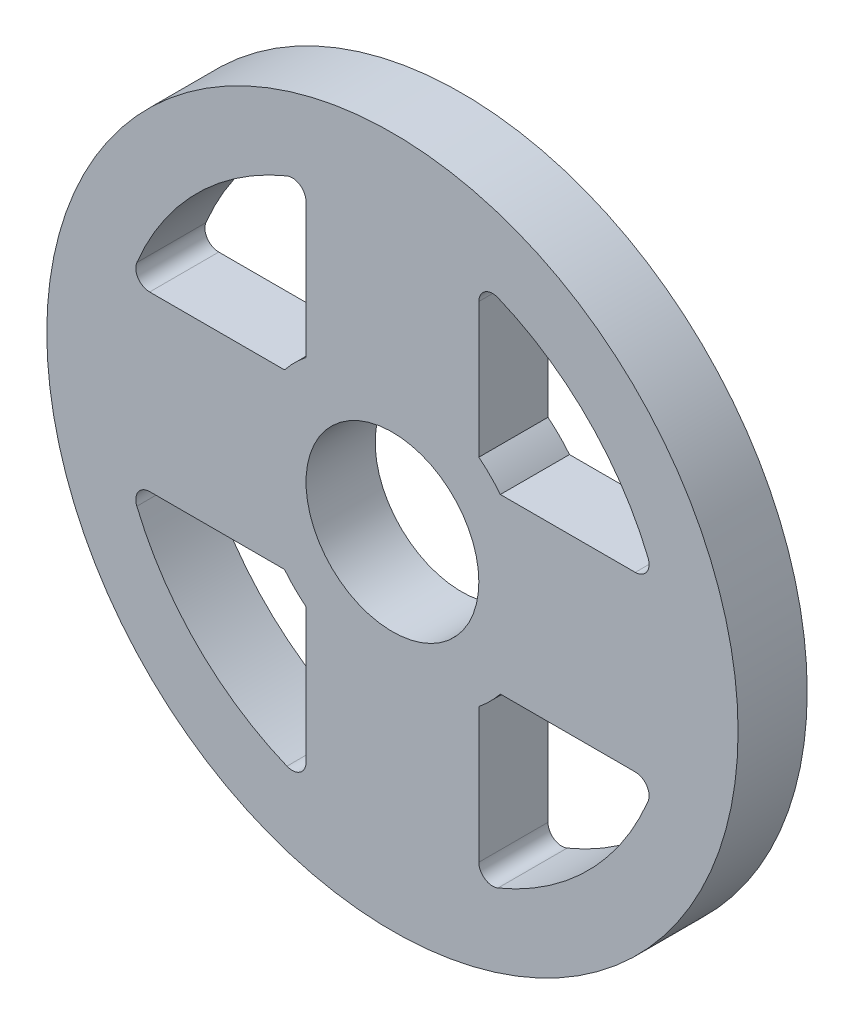
ISO-10303-21;
HEADER;
FILE_DESCRIPTION(('STEP AP214'),'2;1');
FILE_NAME('part.step','',(''),(''),'','','');
FILE_SCHEMA(('AUTOMOTIVE_DESIGN { 1 0 10303 214 1 1 1 1 }'));
ENDSEC;
DATA;
#1=APPLICATION_CONTEXT('core data for automotive mechanical design processes');
#2=APPLICATION_PROTOCOL_DEFINITION('international standard','automotive_design',2000,#1);
#3=PRODUCT_CONTEXT('',#1,'mechanical');
#4=PRODUCT('Part','Part','',(#3));
#5=PRODUCT_RELATED_PRODUCT_CATEGORY('part','',(#4));
#6=PRODUCT_DEFINITION_FORMATION('','',#4);
#7=PRODUCT_DEFINITION_CONTEXT('part definition',#1,'design');
#8=PRODUCT_DEFINITION('design','',#6,#7);
#9=PRODUCT_DEFINITION_SHAPE('','',#8);
#10=(LENGTH_UNIT() NAMED_UNIT(*) SI_UNIT(.MILLI.,.METRE.));
#11=(NAMED_UNIT(*) PLANE_ANGLE_UNIT() SI_UNIT($,.RADIAN.));
#12=(NAMED_UNIT(*) SI_UNIT($,.STERADIAN.) SOLID_ANGLE_UNIT());
#13=UNCERTAINTY_MEASURE_WITH_UNIT(LENGTH_MEASURE(1.E-05),#10,'distance_accuracy_value','');
#14=(GEOMETRIC_REPRESENTATION_CONTEXT(3) GLOBAL_UNCERTAINTY_ASSIGNED_CONTEXT((#13)) GLOBAL_UNIT_ASSIGNED_CONTEXT((#10,
#11,#12)) REPRESENTATION_CONTEXT('',''));
#15=CARTESIAN_POINT('',(0.,0.,0.));
#16=DIRECTION('',(0.,0.,1.));
#17=DIRECTION('',(1.,0.,0.));
#18=AXIS2_PLACEMENT_3D('',#15,#16,#17);
#19=CARTESIAN_POINT('',(0.,0.,5.));
#20=DIRECTION('',(0.,0.,-1.));
#21=DIRECTION('',(-1.,0.,0.));
#22=AXIS2_PLACEMENT_3D('',#19,#20,#21);
#23=CYLINDRICAL_SURFACE('',#22,10.);
#24=CARTESIAN_POINT('',(0.,0.,0.));
#25=DIRECTION('',(0.,0.,1.));
#26=DIRECTION('',(1.,0.,0.));
#27=AXIS2_PLACEMENT_3D('',#24,#25,#26);
#28=CIRCLE('',#27,10.);
#29=CARTESIAN_POINT('',(-6.24999999999992,7.80624749799806,0.));
#30=VERTEX_POINT('',#29);
#31=CARTESIAN_POINT('',(-7.80624749799795,6.25000000000006,0.));
#32=VERTEX_POINT('',#31);
#33=EDGE_CURVE('E242',#30,#32,#28,.T.);
#34=ORIENTED_EDGE('',*,*,#33,.T.);
#35=DIRECTION('',(0.,0.,-1.));
#36=VECTOR('',#35,1.);
#37=CARTESIAN_POINT('',(-7.80624749799795,6.25000000000006,5.));
#38=LINE('',#37,#36);
#39=CARTESIAN_POINT('',(-7.80624749799795,6.25000000000006,5.));
#40=VERTEX_POINT('',#39);
#41=EDGE_CURVE('E11',#40,#32,#38,.T.);
#42=ORIENTED_EDGE('',*,*,#41,.F.);
#43=CARTESIAN_POINT('',(0.,0.,5.));
#44=DIRECTION('',(0.,0.,1.));
#45=DIRECTION('',(1.,0.,0.));
#46=AXIS2_PLACEMENT_3D('',#43,#44,#45);
#47=CIRCLE('',#46,10.);
#48=CARTESIAN_POINT('',(-6.24999999999992,7.80624749799806,5.));
#49=VERTEX_POINT('',#48);
#50=EDGE_CURVE('E456',#49,#40,#47,.T.);
#51=ORIENTED_EDGE('',*,*,#50,.F.);
#52=DIRECTION('',(0.,0.,-1.));
#53=VECTOR('',#52,1.);
#54=CARTESIAN_POINT('',(-6.24999999999992,7.80624749799806,5.));
#55=LINE('',#54,#53);
#56=EDGE_CURVE('E54',#49,#30,#55,.T.);
#57=ORIENTED_EDGE('',*,*,#56,.T.);
#58=EDGE_LOOP('',(#34,#42,#51,#57));
#59=FACE_BOUND('',#58,.T.);
#60=ADVANCED_FACE('F35',(#59),#23,.T.);
#61=CARTESIAN_POINT('',(0.,6.25,5.));
#62=DIRECTION('',(0.,-1.,0.));
#63=DIRECTION('',(1.,0.,0.));
#64=AXIS2_PLACEMENT_3D('',#61,#62,#63);
#65=PLANE('',#64);
#66=DIRECTION('',(-1.,0.,0.));
#67=VECTOR('',#66,1.);
#68=CARTESIAN_POINT('',(0.,6.25,0.));
#69=LINE('',#68,#67);
#70=CARTESIAN_POINT('',(-17.5623887896834,6.25000000000012,0.));
#71=VERTEX_POINT('',#70);
#72=EDGE_CURVE('E289',#32,#71,#69,.T.);
#73=ORIENTED_EDGE('',*,*,#72,.T.);
#74=DIRECTION('',(0.,0.,-1.));
#75=VECTOR('',#74,1.);
#76=CARTESIAN_POINT('',(-17.5623887896834,6.25000000000012,5.));
#77=LINE('',#76,#75);
#78=CARTESIAN_POINT('',(-17.5623887896834,6.25000000000012,5.));
#79=VERTEX_POINT('',#78);
#80=EDGE_CURVE('E45',#79,#71,#77,.T.);
#81=ORIENTED_EDGE('',*,*,#80,.F.);
#82=DIRECTION('',(-1.,0.,0.));
#83=VECTOR('',#82,1.);
#84=CARTESIAN_POINT('',(0.,6.25,5.));
#85=LINE('',#84,#83);
#86=EDGE_CURVE('E455',#40,#79,#85,.T.);
#87=ORIENTED_EDGE('',*,*,#86,.F.);
#88=ORIENTED_EDGE('',*,*,#41,.T.);
#89=EDGE_LOOP('',(#73,#81,#87,#88));
#90=FACE_BOUND('',#89,.T.);
#91=ADVANCED_FACE('F383',(#90),#65,.F.);
#92=CARTESIAN_POINT('',(-17.5623887896834,7.25000000000012,5.));
#93=DIRECTION('',(0.,0.,-1.));
#94=DIRECTION('',(-1.,0.,0.));
#95=AXIS2_PLACEMENT_3D('',#92,#93,#94);
#96=CYLINDRICAL_SURFACE('',#95,1.);
#97=CARTESIAN_POINT('',(-17.5623887896834,7.25000000000012,0.));
#98=DIRECTION('',(0.,0.,1.));
#99=DIRECTION('',(1.,0.,0.));
#100=AXIS2_PLACEMENT_3D('',#97,#98,#99);
#101=CIRCLE('',#100,1.);
#102=CARTESIAN_POINT('',(-18.486725041772,7.63157894736855,0.));
#103=VERTEX_POINT('',#102);
#104=EDGE_CURVE('E291',#71,#103,#101,.F.);
#105=ORIENTED_EDGE('',*,*,#104,.T.);
#106=DIRECTION('',(0.,0.,-1.));
#107=VECTOR('',#106,1.);
#108=CARTESIAN_POINT('',(-18.486725041772,7.63157894736855,5.));
#109=LINE('',#108,#107);
#110=CARTESIAN_POINT('',(-18.486725041772,7.63157894736855,5.));
#111=VERTEX_POINT('',#110);
#112=EDGE_CURVE('E213',#111,#103,#109,.T.);
#113=ORIENTED_EDGE('',*,*,#112,.F.);
#114=CARTESIAN_POINT('',(-17.5623887896834,7.25000000000012,5.));
#115=DIRECTION('',(0.,0.,1.));
#116=DIRECTION('',(1.,0.,0.));
#117=AXIS2_PLACEMENT_3D('',#114,#115,#116);
#118=CIRCLE('',#117,1.);
#119=EDGE_CURVE('E223',#79,#111,#118,.F.);
#120=ORIENTED_EDGE('',*,*,#119,.F.);
#121=ORIENTED_EDGE('',*,*,#80,.T.);
#122=EDGE_LOOP('',(#105,#113,#120,#121));
#123=FACE_BOUND('',#122,.T.);
#124=ADVANCED_FACE('F388',(#123),#96,.F.);
#125=CARTESIAN_POINT('',(0.,0.,5.));
#126=DIRECTION('',(0.,0.,-1.));
#127=DIRECTION('',(-1.,0.,0.));
#128=AXIS2_PLACEMENT_3D('',#125,#126,#127);
#129=CYLINDRICAL_SURFACE('',#128,20.);
#130=CARTESIAN_POINT('',(0.,0.,0.));
#131=DIRECTION('',(0.,0.,1.));
#132=DIRECTION('',(1.,0.,0.));
#133=AXIS2_PLACEMENT_3D('',#130,#131,#132);
#134=CIRCLE('',#133,20.);
#135=CARTESIAN_POINT('',(-7.63157894736823,18.4867250417722,0.));
#136=VERTEX_POINT('',#135);
#137=EDGE_CURVE('E209',#136,#103,#134,.T.);
#138=ORIENTED_EDGE('',*,*,#137,.F.);
#139=DIRECTION('',(0.,0.,-1.));
#140=VECTOR('',#139,1.);
#141=CARTESIAN_POINT('',(-7.63157894736823,18.4867250417722,5.));
#142=LINE('',#141,#140);
#143=CARTESIAN_POINT('',(-7.63157894736823,18.4867250417722,5.));
#144=VERTEX_POINT('',#143);
#145=EDGE_CURVE('E204',#144,#136,#142,.T.);
#146=ORIENTED_EDGE('',*,*,#145,.F.);
#147=CARTESIAN_POINT('',(0.,0.,5.));
#148=DIRECTION('',(0.,0.,1.));
#149=DIRECTION('',(1.,0.,0.));
#150=AXIS2_PLACEMENT_3D('',#147,#148,#149);
#151=CIRCLE('',#150,20.);
#152=EDGE_CURVE('E207',#144,#111,#151,.T.);
#153=ORIENTED_EDGE('',*,*,#152,.T.);
#154=ORIENTED_EDGE('',*,*,#112,.T.);
#155=EDGE_LOOP('',(#138,#146,#153,#154));
#156=FACE_BOUND('',#155,.T.);
#157=ADVANCED_FACE('F206',(#156),#129,.F.);
#158=CARTESIAN_POINT('',(-7.24999999999982,17.5623887896836,5.));
#159=DIRECTION('',(0.,0.,-1.));
#160=DIRECTION('',(-1.,0.,0.));
#161=AXIS2_PLACEMENT_3D('',#158,#159,#160);
#162=CYLINDRICAL_SURFACE('',#161,1.);
#163=CARTESIAN_POINT('',(-7.24999999999982,17.5623887896836,0.));
#164=DIRECTION('',(0.,0.,1.));
#165=DIRECTION('',(1.,0.,0.));
#166=AXIS2_PLACEMENT_3D('',#163,#164,#165);
#167=CIRCLE('',#166,1.);
#168=CARTESIAN_POINT('',(-6.24999999999982,17.5623887896835,0.));
#169=VERTEX_POINT('',#168);
#170=EDGE_CURVE('E295',#169,#136,#167,.T.);
#171=ORIENTED_EDGE('',*,*,#170,.F.);
#172=DIRECTION('',(0.,0.,-1.));
#173=VECTOR('',#172,1.);
#174=CARTESIAN_POINT('',(-6.24999999999982,17.5623887896835,5.));
#175=LINE('',#174,#173);
#176=CARTESIAN_POINT('',(-6.24999999999982,17.5623887896835,5.));
#177=VERTEX_POINT('',#176);
#178=EDGE_CURVE('E128',#177,#169,#175,.T.);
#179=ORIENTED_EDGE('',*,*,#178,.F.);
#180=CARTESIAN_POINT('',(-7.24999999999982,17.5623887896836,5.));
#181=DIRECTION('',(0.,0.,1.));
#182=DIRECTION('',(1.,0.,0.));
#183=AXIS2_PLACEMENT_3D('',#180,#181,#182);
#184=CIRCLE('',#183,1.);
#185=EDGE_CURVE('E221',#177,#144,#184,.T.);
#186=ORIENTED_EDGE('',*,*,#185,.T.);
#187=ORIENTED_EDGE('',*,*,#145,.T.);
#188=EDGE_LOOP('',(#171,#179,#186,#187));
#189=FACE_BOUND('',#188,.T.);
#190=ADVANCED_FACE('F226',(#189),#162,.F.);
#191=CARTESIAN_POINT('',(0.,-6.25,5.));
#192=DIRECTION('',(0.,-1.,0.));
#193=DIRECTION('',(1.,0.,0.));
#194=AXIS2_PLACEMENT_3D('',#191,#192,#193);
#195=PLANE('',#194);
#196=DIRECTION('',(-1.,0.,0.));
#197=VECTOR('',#196,1.);
#198=CARTESIAN_POINT('',(0.,-6.25,0.));
#199=LINE('',#198,#197);
#200=CARTESIAN_POINT('',(-7.80624749799804,-6.24999999999995,0.));
#201=VERTEX_POINT('',#200);
#202=CARTESIAN_POINT('',(-17.5623887896835,-6.24999999999988,0.));
#203=VERTEX_POINT('',#202);
#204=EDGE_CURVE('E270',#201,#203,#199,.T.);
#205=ORIENTED_EDGE('',*,*,#204,.F.);
#206=DIRECTION('',(0.,0.,-1.));
#207=VECTOR('',#206,1.);
#208=CARTESIAN_POINT('',(-7.80624749799804,-6.24999999999995,5.));
#209=LINE('',#208,#207);
#210=CARTESIAN_POINT('',(-7.80624749799804,-6.24999999999995,5.));
#211=VERTEX_POINT('',#210);
#212=EDGE_CURVE('E305',#211,#201,#209,.T.);
#213=ORIENTED_EDGE('',*,*,#212,.F.);
#214=DIRECTION('',(-1.,0.,0.));
#215=VECTOR('',#214,1.);
#216=CARTESIAN_POINT('',(0.,-6.25,5.));
#217=LINE('',#216,#215);
#218=CARTESIAN_POINT('',(-17.5623887896835,-6.24999999999988,5.));
#219=VERTEX_POINT('',#218);
#220=EDGE_CURVE('E468',#211,#219,#217,.T.);
#221=ORIENTED_EDGE('',*,*,#220,.T.);
#222=DIRECTION('',(0.,0.,-1.));
#223=VECTOR('',#222,1.);
#224=CARTESIAN_POINT('',(-17.5623887896835,-6.24999999999988,5.));
#225=LINE('',#224,#223);
#226=EDGE_CURVE('E310',#219,#203,#225,.T.);
#227=ORIENTED_EDGE('',*,*,#226,.T.);
#228=EDGE_LOOP('',(#205,#213,#221,#227));
#229=FACE_BOUND('',#228,.T.);
#230=ADVANCED_FACE('F394',(#229),#195,.T.);
#231=CARTESIAN_POINT('',(-6.25000000000003,-7.80624749799798,0.));
#232=VERTEX_POINT('',#231);
#233=EDGE_CURVE('E273',#201,#232,#28,.T.);
#234=ORIENTED_EDGE('',*,*,#233,.T.);
#235=DIRECTION('',(0.,0.,-1.));
#236=VECTOR('',#235,1.);
#237=CARTESIAN_POINT('',(-6.25000000000003,-7.80624749799798,5.));
#238=LINE('',#237,#236);
#239=CARTESIAN_POINT('',(-6.25000000000003,-7.80624749799798,5.));
#240=VERTEX_POINT('',#239);
#241=EDGE_CURVE('E319',#240,#232,#238,.T.);
#242=ORIENTED_EDGE('',*,*,#241,.F.);
#243=EDGE_CURVE('E460',#211,#240,#47,.T.);
#244=ORIENTED_EDGE('',*,*,#243,.F.);
#245=ORIENTED_EDGE('',*,*,#212,.T.);
#246=EDGE_LOOP('',(#234,#242,#244,#245));
#247=FACE_BOUND('',#246,.T.);
#248=ADVANCED_FACE('F384',(#247),#23,.T.);
#249=CARTESIAN_POINT('',(-6.25,0.,5.));
#250=DIRECTION('',(1.,0.,0.));
#251=DIRECTION('',(0.,1.,0.));
#252=AXIS2_PLACEMENT_3D('',#249,#250,#251);
#253=PLANE('',#252);
#254=DIRECTION('',(0.,-1.,0.));
#255=VECTOR('',#254,1.);
#256=CARTESIAN_POINT('',(-6.25,0.,0.));
#257=LINE('',#256,#255);
#258=CARTESIAN_POINT('',(-6.25000000000006,-17.5623887896835,0.));
#259=VERTEX_POINT('',#258);
#260=EDGE_CURVE('E274',#232,#259,#257,.T.);
#261=ORIENTED_EDGE('',*,*,#260,.T.);
#262=DIRECTION('',(0.,0.,-1.));
#263=VECTOR('',#262,1.);
#264=CARTESIAN_POINT('',(-6.25000000000006,-17.5623887896835,5.));
#265=LINE('',#264,#263);
#266=CARTESIAN_POINT('',(-6.25000000000006,-17.5623887896835,5.));
#267=VERTEX_POINT('',#266);
#268=EDGE_CURVE('E317',#267,#259,#265,.T.);
#269=ORIENTED_EDGE('',*,*,#268,.F.);
#270=DIRECTION('',(0.,-1.,0.));
#271=VECTOR('',#270,1.);
#272=CARTESIAN_POINT('',(-6.25,0.,5.));
#273=LINE('',#272,#271);
#274=EDGE_CURVE('E467',#240,#267,#273,.T.);
#275=ORIENTED_EDGE('',*,*,#274,.F.);
#276=ORIENTED_EDGE('',*,*,#241,.T.);
#277=EDGE_LOOP('',(#261,#269,#275,#276));
#278=FACE_BOUND('',#277,.T.);
#279=ADVANCED_FACE('F393',(#278),#253,.F.);
#280=CARTESIAN_POINT('',(-7.25000000000006,-17.5623887896835,5.));
#281=DIRECTION('',(0.,0.,-1.));
#282=DIRECTION('',(-1.,0.,0.));
#283=AXIS2_PLACEMENT_3D('',#280,#281,#282);
#284=CYLINDRICAL_SURFACE('',#283,1.);
#285=CARTESIAN_POINT('',(-7.25000000000006,-17.5623887896835,0.));
#286=DIRECTION('',(0.,0.,1.));
#287=DIRECTION('',(1.,0.,0.));
#288=AXIS2_PLACEMENT_3D('',#285,#286,#287);
#289=CIRCLE('',#288,1.);
#290=CARTESIAN_POINT('',(-7.63157894736849,-18.4867250417721,0.));
#291=VERTEX_POINT('',#290);
#292=EDGE_CURVE('E277',#291,#259,#289,.T.);
#293=ORIENTED_EDGE('',*,*,#292,.F.);
#294=DIRECTION('',(0.,0.,-1.));
#295=VECTOR('',#294,1.);
#296=CARTESIAN_POINT('',(-7.63157894736849,-18.4867250417721,5.));
#297=LINE('',#296,#295);
#298=CARTESIAN_POINT('',(-7.63157894736849,-18.4867250417721,5.));
#299=VERTEX_POINT('',#298);
#300=EDGE_CURVE('E315',#299,#291,#297,.T.);
#301=ORIENTED_EDGE('',*,*,#300,.F.);
#302=CARTESIAN_POINT('',(-7.25000000000006,-17.5623887896835,5.));
#303=DIRECTION('',(0.,0.,1.));
#304=DIRECTION('',(1.,0.,0.));
#305=AXIS2_PLACEMENT_3D('',#302,#303,#304);
#306=CIRCLE('',#305,1.);
#307=EDGE_CURVE('E497',#299,#267,#306,.T.);
#308=ORIENTED_EDGE('',*,*,#307,.T.);
#309=ORIENTED_EDGE('',*,*,#268,.T.);
#310=EDGE_LOOP('',(#293,#301,#308,#309));
#311=FACE_BOUND('',#310,.T.);
#312=ADVANCED_FACE('F400',(#311),#284,.F.);
#313=CARTESIAN_POINT('',(0.,0.,5.));
#314=DIRECTION('',(0.,0.,-1.));
#315=DIRECTION('',(-1.,0.,0.));
#316=AXIS2_PLACEMENT_3D('',#313,#314,#315);
#317=CYLINDRICAL_SURFACE('',#316,20.);
#318=CARTESIAN_POINT('',(0.,0.,0.));
#319=DIRECTION('',(0.,0.,1.));
#320=DIRECTION('',(1.,0.,0.));
#321=AXIS2_PLACEMENT_3D('',#318,#319,#320);
#322=CIRCLE('',#321,20.);
#323=CARTESIAN_POINT('',(-18.4867250417721,-7.63157894736829,0.));
#324=VERTEX_POINT('',#323);
#325=EDGE_CURVE('E280',#324,#291,#322,.T.);
#326=ORIENTED_EDGE('',*,*,#325,.F.);
#327=DIRECTION('',(0.,0.,-1.));
#328=VECTOR('',#327,1.);
#329=CARTESIAN_POINT('',(-18.4867250417721,-7.63157894736829,5.));
#330=LINE('',#329,#328);
#331=CARTESIAN_POINT('',(-18.4867250417721,-7.63157894736829,5.));
#332=VERTEX_POINT('',#331);
#333=EDGE_CURVE('E312',#332,#324,#330,.T.);
#334=ORIENTED_EDGE('',*,*,#333,.F.);
#335=CARTESIAN_POINT('',(0.,0.,5.));
#336=DIRECTION('',(0.,0.,1.));
#337=DIRECTION('',(1.,0.,0.));
#338=AXIS2_PLACEMENT_3D('',#335,#336,#337);
#339=CIRCLE('',#338,20.);
#340=EDGE_CURVE('E500',#332,#299,#339,.T.);
#341=ORIENTED_EDGE('',*,*,#340,.T.);
#342=ORIENTED_EDGE('',*,*,#300,.T.);
#343=EDGE_LOOP('',(#326,#334,#341,#342));
#344=FACE_BOUND('',#343,.T.);
#345=ADVANCED_FACE('F417',(#344),#317,.F.);
#346=CARTESIAN_POINT('',(6.25,0.,5.));
#347=DIRECTION('',(1.,0.,0.));
#348=DIRECTION('',(0.,1.,0.));
#349=AXIS2_PLACEMENT_3D('',#346,#347,#348);
#350=PLANE('',#349);
#351=DIRECTION('',(0.,-1.,0.));
#352=VECTOR('',#351,1.);
#353=CARTESIAN_POINT('',(6.25,0.,0.));
#354=LINE('',#353,#352);
#355=CARTESIAN_POINT('',(6.24999999999997,-7.80624749799802,0.));
#356=VERTEX_POINT('',#355);
#357=CARTESIAN_POINT('',(6.24999999999994,-17.5623887896835,0.));
#358=VERTEX_POINT('',#357);
#359=EDGE_CURVE('E255',#356,#358,#354,.T.);
#360=ORIENTED_EDGE('',*,*,#359,.F.);
#361=DIRECTION('',(0.,0.,-1.));
#362=VECTOR('',#361,1.);
#363=CARTESIAN_POINT('',(6.24999999999997,-7.80624749799802,5.));
#364=LINE('',#363,#362);
#365=CARTESIAN_POINT('',(6.24999999999997,-7.80624749799802,5.));
#366=VERTEX_POINT('',#365);
#367=EDGE_CURVE('E313',#366,#356,#364,.T.);
#368=ORIENTED_EDGE('',*,*,#367,.F.);
#369=DIRECTION('',(0.,-1.,0.));
#370=VECTOR('',#369,1.);
#371=CARTESIAN_POINT('',(6.25,0.,5.));
#372=LINE('',#371,#370);
#373=CARTESIAN_POINT('',(6.24999999999994,-17.5623887896835,5.));
#374=VERTEX_POINT('',#373);
#375=EDGE_CURVE('E474',#366,#374,#372,.T.);
#376=ORIENTED_EDGE('',*,*,#375,.T.);
#377=DIRECTION('',(0.,0.,-1.));
#378=VECTOR('',#377,1.);
#379=CARTESIAN_POINT('',(6.24999999999994,-17.5623887896835,5.));
#380=LINE('',#379,#378);
#381=EDGE_CURVE('E323',#374,#358,#380,.T.);
#382=ORIENTED_EDGE('',*,*,#381,.T.);
#383=EDGE_LOOP('',(#360,#368,#376,#382));
#384=FACE_BOUND('',#383,.T.);
#385=ADVANCED_FACE('F408',(#384),#350,.T.);
#386=CARTESIAN_POINT('',(7.806247497998,-6.25,0.));
#387=VERTEX_POINT('',#386);
#388=EDGE_CURVE('E243',#356,#387,#28,.T.);
#389=ORIENTED_EDGE('',*,*,#388,.T.);
#390=DIRECTION('',(0.,0.,-1.));
#391=VECTOR('',#390,1.);
#392=CARTESIAN_POINT('',(7.806247497998,-6.25,5.));
#393=LINE('',#392,#391);
#394=CARTESIAN_POINT('',(7.806247497998,-6.25,5.));
#395=VERTEX_POINT('',#394);
#396=EDGE_CURVE('E331',#395,#387,#393,.T.);
#397=ORIENTED_EDGE('',*,*,#396,.F.);
#398=EDGE_CURVE('E469',#366,#395,#47,.T.);
#399=ORIENTED_EDGE('',*,*,#398,.F.);
#400=ORIENTED_EDGE('',*,*,#367,.T.);
#401=EDGE_LOOP('',(#389,#397,#399,#400));
#402=FACE_BOUND('',#401,.T.);
#403=ADVANCED_FACE('F381',(#402),#23,.T.);
#404=CARTESIAN_POINT('',(0.,-6.25,5.));
#405=DIRECTION('',(0.,1.,0.));
#406=DIRECTION('',(0.,0.,1.));
#407=AXIS2_PLACEMENT_3D('',#404,#405,#406);
#408=PLANE('',#407);
#409=DIRECTION('',(1.,0.,0.));
#410=VECTOR('',#409,1.);
#411=CARTESIAN_POINT('',(0.,-6.25,0.));
#412=LINE('',#411,#410);
#413=CARTESIAN_POINT('',(17.5623887896835,-6.25,0.));
#414=VERTEX_POINT('',#413);
#415=EDGE_CURVE('E258',#387,#414,#412,.T.);
#416=ORIENTED_EDGE('',*,*,#415,.T.);
#417=DIRECTION('',(0.,0.,-1.));
#418=VECTOR('',#417,1.);
#419=CARTESIAN_POINT('',(17.5623887896835,-6.25,5.));
#420=LINE('',#419,#418);
#421=CARTESIAN_POINT('',(17.5623887896835,-6.25,5.));
#422=VERTEX_POINT('',#421);
#423=EDGE_CURVE('E329',#422,#414,#420,.T.);
#424=ORIENTED_EDGE('',*,*,#423,.F.);
#425=DIRECTION('',(1.,0.,0.));
#426=VECTOR('',#425,1.);
#427=CARTESIAN_POINT('',(0.,-6.25,5.));
#428=LINE('',#427,#426);
#429=EDGE_CURVE('E473',#395,#422,#428,.T.);
#430=ORIENTED_EDGE('',*,*,#429,.F.);
#431=ORIENTED_EDGE('',*,*,#396,.T.);
#432=EDGE_LOOP('',(#416,#424,#430,#431));
#433=FACE_BOUND('',#432,.T.);
#434=ADVANCED_FACE('F407',(#433),#408,.F.);
#435=CARTESIAN_POINT('',(17.5623887896835,-7.25,5.));
#436=DIRECTION('',(0.,0.,-1.));
#437=DIRECTION('',(-1.,0.,0.));
#438=AXIS2_PLACEMENT_3D('',#435,#436,#437);
#439=CYLINDRICAL_SURFACE('',#438,1.);
#440=CARTESIAN_POINT('',(17.5623887896835,-7.25,0.));
#441=DIRECTION('',(0.,0.,1.));
#442=DIRECTION('',(1.,0.,0.));
#443=AXIS2_PLACEMENT_3D('',#440,#441,#442);
#444=CIRCLE('',#443,1.);
#445=CARTESIAN_POINT('',(18.4867250417721,-7.63157894736842,0.));
#446=VERTEX_POINT('',#445);
#447=EDGE_CURVE('E261',#446,#414,#444,.T.);
#448=ORIENTED_EDGE('',*,*,#447,.F.);
#449=DIRECTION('',(0.,0.,-1.));
#450=VECTOR('',#449,1.);
#451=CARTESIAN_POINT('',(18.4867250417721,-7.63157894736842,5.));
#452=LINE('',#451,#450);
#453=CARTESIAN_POINT('',(18.4867250417721,-7.63157894736842,5.));
#454=VERTEX_POINT('',#453);
#455=EDGE_CURVE('E327',#454,#446,#452,.T.);
#456=ORIENTED_EDGE('',*,*,#455,.F.);
#457=CARTESIAN_POINT('',(17.5623887896835,-7.25,5.));
#458=DIRECTION('',(0.,0.,1.));
#459=DIRECTION('',(1.,0.,0.));
#460=AXIS2_PLACEMENT_3D('',#457,#458,#459);
#461=CIRCLE('',#460,1.);
#462=EDGE_CURVE('E477',#454,#422,#461,.T.);
#463=ORIENTED_EDGE('',*,*,#462,.T.);
#464=ORIENTED_EDGE('',*,*,#423,.T.);
#465=EDGE_LOOP('',(#448,#456,#463,#464));
#466=FACE_BOUND('',#465,.T.);
#467=ADVANCED_FACE('F414',(#466),#439,.F.);
#468=CARTESIAN_POINT('',(0.,0.,5.));
#469=DIRECTION('',(0.,0.,-1.));
#470=DIRECTION('',(-1.,0.,0.));
#471=AXIS2_PLACEMENT_3D('',#468,#469,#470);
#472=CYLINDRICAL_SURFACE('',#471,20.);
#473=CARTESIAN_POINT('',(0.,0.,0.));
#474=DIRECTION('',(0.,0.,1.));
#475=DIRECTION('',(1.,0.,0.));
#476=AXIS2_PLACEMENT_3D('',#473,#474,#475);
#477=CIRCLE('',#476,20.);
#478=CARTESIAN_POINT('',(7.63157894736835,-18.4867250417721,0.));
#479=VERTEX_POINT('',#478);
#480=EDGE_CURVE('E264',#479,#446,#477,.T.);
#481=ORIENTED_EDGE('',*,*,#480,.F.);
#482=DIRECTION('',(0.,0.,-1.));
#483=VECTOR('',#482,1.);
#484=CARTESIAN_POINT('',(7.63157894736835,-18.4867250417721,5.));
#485=LINE('',#484,#483);
#486=CARTESIAN_POINT('',(7.63157894736835,-18.4867250417721,5.));
#487=VERTEX_POINT('',#486);
#488=EDGE_CURVE('E325',#487,#479,#485,.T.);
#489=ORIENTED_EDGE('',*,*,#488,.F.);
#490=CARTESIAN_POINT('',(0.,0.,5.));
#491=DIRECTION('',(0.,0.,1.));
#492=DIRECTION('',(1.,0.,0.));
#493=AXIS2_PLACEMENT_3D('',#490,#491,#492);
#494=CIRCLE('',#493,20.);
#495=EDGE_CURVE('E488',#487,#454,#494,.T.);
#496=ORIENTED_EDGE('',*,*,#495,.T.);
#497=ORIENTED_EDGE('',*,*,#455,.T.);
#498=EDGE_LOOP('',(#481,#489,#496,#497));
#499=FACE_BOUND('',#498,.T.);
#500=ADVANCED_FACE('F540',(#499),#472,.F.);
#501=CARTESIAN_POINT('',(0.,6.25,5.));
#502=DIRECTION('',(0.,1.,0.));
#503=DIRECTION('',(0.,0.,1.));
#504=AXIS2_PLACEMENT_3D('',#501,#502,#503);
#505=PLANE('',#504);
#506=DIRECTION('',(1.,0.,0.));
#507=VECTOR('',#506,1.);
#508=CARTESIAN_POINT('',(0.,6.25,0.));
#509=LINE('',#508,#507);
#510=CARTESIAN_POINT('',(7.806247497998,6.25,0.));
#511=VERTEX_POINT('',#510);
#512=CARTESIAN_POINT('',(17.5623887896835,6.25,0.));
#513=VERTEX_POINT('',#512);
#514=EDGE_CURVE('E236',#511,#513,#509,.T.);
#515=ORIENTED_EDGE('',*,*,#514,.F.);
#516=DIRECTION('',(0.,0.,-1.));
#517=VECTOR('',#516,1.);
#518=CARTESIAN_POINT('',(7.806247497998,6.25,5.));
#519=LINE('',#518,#517);
#520=CARTESIAN_POINT('',(7.806247497998,6.25,5.));
#521=VERTEX_POINT('',#520);
#522=EDGE_CURVE('E39',#521,#511,#519,.T.);
#523=ORIENTED_EDGE('',*,*,#522,.F.);
#524=DIRECTION('',(1.,0.,0.));
#525=VECTOR('',#524,1.);
#526=CARTESIAN_POINT('',(0.,6.25,5.));
#527=LINE('',#526,#525);
#528=CARTESIAN_POINT('',(17.5623887896835,6.25,5.));
#529=VERTEX_POINT('',#528);
#530=EDGE_CURVE('E303',#521,#529,#527,.T.);
#531=ORIENTED_EDGE('',*,*,#530,.T.);
#532=DIRECTION('',(0.,0.,-1.));
#533=VECTOR('',#532,1.);
#534=CARTESIAN_POINT('',(17.5623887896835,6.25,5.));
#535=LINE('',#534,#533);
#536=EDGE_CURVE('E235',#529,#513,#535,.T.);
#537=ORIENTED_EDGE('',*,*,#536,.T.);
#538=EDGE_LOOP('',(#515,#523,#531,#537));
#539=FACE_BOUND('',#538,.T.);
#540=ADVANCED_FACE('F37',(#539),#505,.T.);
#541=CARTESIAN_POINT('',(6.25000000000008,7.80624749799793,0.));
#542=VERTEX_POINT('',#541);
#543=EDGE_CURVE('E239',#511,#542,#28,.T.);
#544=ORIENTED_EDGE('',*,*,#543,.T.);
#545=DIRECTION('',(0.,0.,-1.));
#546=VECTOR('',#545,1.);
#547=CARTESIAN_POINT('',(6.25000000000008,7.80624749799793,5.));
#548=LINE('',#547,#546);
#549=CARTESIAN_POINT('',(6.25000000000008,7.80624749799793,5.));
#550=VERTEX_POINT('',#549);
#551=EDGE_CURVE('E341',#550,#542,#548,.T.);
#552=ORIENTED_EDGE('',*,*,#551,.F.);
#553=EDGE_CURVE('E350',#521,#550,#47,.T.);
#554=ORIENTED_EDGE('',*,*,#553,.F.);
#555=ORIENTED_EDGE('',*,*,#522,.T.);
#556=EDGE_LOOP('',(#544,#552,#554,#555));
#557=FACE_BOUND('',#556,.T.);
#558=ADVANCED_FACE('F349',(#557),#23,.T.);
#559=CARTESIAN_POINT('',(6.25,0.,5.));
#560=DIRECTION('',(-1.,0.,0.));
#561=DIRECTION('',(0.,-1.,0.));
#562=AXIS2_PLACEMENT_3D('',#559,#560,#561);
#563=PLANE('',#562);
#564=DIRECTION('',(0.,1.,0.));
#565=VECTOR('',#564,1.);
#566=CARTESIAN_POINT('',(6.25,0.,0.));
#567=LINE('',#566,#565);
#568=CARTESIAN_POINT('',(6.25000000000018,17.5623887896834,0.));
#569=VERTEX_POINT('',#568);
#570=EDGE_CURVE('E241',#542,#569,#567,.T.);
#571=ORIENTED_EDGE('',*,*,#570,.T.);
#572=DIRECTION('',(0.,0.,-1.));
#573=VECTOR('',#572,1.);
#574=CARTESIAN_POINT('',(6.25000000000018,17.5623887896834,5.));
#575=LINE('',#574,#573);
#576=CARTESIAN_POINT('',(6.25000000000018,17.5623887896834,5.));
#577=VERTEX_POINT('',#576);
#578=EDGE_CURVE('E340',#577,#569,#575,.T.);
#579=ORIENTED_EDGE('',*,*,#578,.F.);
#580=DIRECTION('',(0.,1.,0.));
#581=VECTOR('',#580,1.);
#582=CARTESIAN_POINT('',(6.25,0.,5.));
#583=LINE('',#582,#581);
#584=EDGE_CURVE('E470',#550,#577,#583,.T.);
#585=ORIENTED_EDGE('',*,*,#584,.F.);
#586=ORIENTED_EDGE('',*,*,#551,.T.);
#587=EDGE_LOOP('',(#571,#579,#585,#586));
#588=FACE_BOUND('',#587,.T.);
#589=ADVANCED_FACE('F373',(#588),#563,.F.);
#590=CARTESIAN_POINT('',(7.25000000000018,17.5623887896834,5.));
#591=DIRECTION('',(0.,0.,-1.));
#592=DIRECTION('',(-1.,0.,0.));
#593=AXIS2_PLACEMENT_3D('',#590,#591,#592);
#594=CYLINDRICAL_SURFACE('',#593,1.);
#595=CARTESIAN_POINT('',(7.25000000000018,17.5623887896834,0.));
#596=DIRECTION('',(0.,0.,1.));
#597=DIRECTION('',(1.,0.,0.));
#598=AXIS2_PLACEMENT_3D('',#595,#596,#597);
#599=CIRCLE('',#598,1.);
#600=CARTESIAN_POINT('',(7.63157894736862,18.486725041772,0.));
#601=VERTEX_POINT('',#600);
#602=EDGE_CURVE('E246',#601,#569,#599,.T.);
#603=ORIENTED_EDGE('',*,*,#602,.F.);
#604=DIRECTION('',(0.,0.,-1.));
#605=VECTOR('',#604,1.);
#606=CARTESIAN_POINT('',(7.63157894736862,18.486725041772,5.));
#607=LINE('',#606,#605);
#608=CARTESIAN_POINT('',(7.63157894736862,18.486725041772,5.));
#609=VERTEX_POINT('',#608);
#610=EDGE_CURVE('E338',#609,#601,#607,.T.);
#611=ORIENTED_EDGE('',*,*,#610,.F.);
#612=CARTESIAN_POINT('',(7.25000000000018,17.5623887896834,5.));
#613=DIRECTION('',(0.,0.,1.));
#614=DIRECTION('',(1.,0.,0.));
#615=AXIS2_PLACEMENT_3D('',#612,#613,#614);
#616=CIRCLE('',#615,1.);
#617=EDGE_CURVE('E372',#609,#577,#616,.T.);
#618=ORIENTED_EDGE('',*,*,#617,.T.);
#619=ORIENTED_EDGE('',*,*,#578,.T.);
#620=EDGE_LOOP('',(#603,#611,#618,#619));
#621=FACE_BOUND('',#620,.T.);
#622=ADVANCED_FACE('F370',(#621),#594,.F.);
#623=CARTESIAN_POINT('',(0.,0.,5.));
#624=DIRECTION('',(0.,0.,-1.));
#625=DIRECTION('',(-1.,0.,0.));
#626=AXIS2_PLACEMENT_3D('',#623,#624,#625);
#627=CYLINDRICAL_SURFACE('',#626,20.);
#628=CARTESIAN_POINT('',(0.,0.,0.));
#629=DIRECTION('',(0.,0.,1.));
#630=DIRECTION('',(1.,0.,0.));
#631=AXIS2_PLACEMENT_3D('',#628,#629,#630);
#632=CIRCLE('',#631,20.);
#633=CARTESIAN_POINT('',(18.4867250417721,7.63157894736842,0.));
#634=VERTEX_POINT('',#633);
#635=EDGE_CURVE('E249',#634,#601,#632,.T.);
#636=ORIENTED_EDGE('',*,*,#635,.F.);
#637=DIRECTION('',(0.,0.,-1.));
#638=VECTOR('',#637,1.);
#639=CARTESIAN_POINT('',(18.4867250417721,7.63157894736842,5.));
#640=LINE('',#639,#638);
#641=CARTESIAN_POINT('',(18.4867250417721,7.63157894736842,5.));
#642=VERTEX_POINT('',#641);
#643=EDGE_CURVE('E336',#642,#634,#640,.T.);
#644=ORIENTED_EDGE('',*,*,#643,.F.);
#645=CARTESIAN_POINT('',(0.,0.,5.));
#646=DIRECTION('',(0.,0.,1.));
#647=DIRECTION('',(1.,0.,0.));
#648=AXIS2_PLACEMENT_3D('',#645,#646,#647);
#649=CIRCLE('',#648,20.);
#650=EDGE_CURVE('E366',#642,#609,#649,.T.);
#651=ORIENTED_EDGE('',*,*,#650,.T.);
#652=ORIENTED_EDGE('',*,*,#610,.T.);
#653=EDGE_LOOP('',(#636,#644,#651,#652));
#654=FACE_BOUND('',#653,.T.);
#655=ADVANCED_FACE('F362',(#654),#627,.F.);
#656=CARTESIAN_POINT('',(-6.25,0.,5.));
#657=DIRECTION('',(-1.,0.,0.));
#658=DIRECTION('',(0.,-1.,0.));
#659=AXIS2_PLACEMENT_3D('',#656,#657,#658);
#660=PLANE('',#659);
#661=DIRECTION('',(0.,1.,0.));
#662=VECTOR('',#661,1.);
#663=CARTESIAN_POINT('',(-6.25,0.,0.));
#664=LINE('',#663,#662);
#665=EDGE_CURVE('E297',#30,#169,#664,.T.);
#666=ORIENTED_EDGE('',*,*,#665,.F.);
#667=ORIENTED_EDGE('',*,*,#56,.F.);
#668=DIRECTION('',(0.,1.,0.));
#669=VECTOR('',#668,1.);
#670=CARTESIAN_POINT('',(-6.25,0.,5.));
#671=LINE('',#670,#669);
#672=EDGE_CURVE('E227',#49,#177,#671,.T.);
#673=ORIENTED_EDGE('',*,*,#672,.T.);
#674=ORIENTED_EDGE('',*,*,#178,.T.);
#675=EDGE_LOOP('',(#666,#667,#673,#674));
#676=FACE_BOUND('',#675,.T.);
#677=ADVANCED_FACE('F431',(#676),#660,.T.);
#678=CARTESIAN_POINT('',(0.,0.,5.));
#679=DIRECTION('',(0.,0.,-1.));
#680=DIRECTION('',(-1.,0.,0.));
#681=AXIS2_PLACEMENT_3D('',#678,#679,#680);
#682=CYLINDRICAL_SURFACE('',#681,25.);
#683=CARTESIAN_POINT('',(0.,0.,5.));
#684=DIRECTION('',(0.,0.,1.));
#685=DIRECTION('',(1.,0.,0.));
#686=AXIS2_PLACEMENT_3D('',#683,#684,#685);
#687=CIRCLE('',#686,25.);
#688=CARTESIAN_POINT('',(25.,0.,5.));
#689=VERTEX_POINT('',#688);
#690=EDGE_CURVE('E458',#689,#689,#687,.T.);
#691=ORIENTED_EDGE('',*,*,#690,.F.);
#692=EDGE_LOOP('',(#691));
#693=FACE_BOUND('',#692,.T.);
#694=CARTESIAN_POINT('',(0.,0.,0.));
#695=DIRECTION('',(0.,0.,1.));
#696=DIRECTION('',(1.,0.,0.));
#697=AXIS2_PLACEMENT_3D('',#694,#695,#696);
#698=CIRCLE('',#697,25.);
#699=CARTESIAN_POINT('',(25.,0.,0.));
#700=VERTEX_POINT('',#699);
#701=EDGE_CURVE('E286',#700,#700,#698,.T.);
#702=ORIENTED_EDGE('',*,*,#701,.T.);
#703=EDGE_LOOP('',(#702));
#704=FACE_BOUND('',#703,.T.);
#705=ADVANCED_FACE('F433',(#693,#704),#682,.T.);
#706=CARTESIAN_POINT('',(-17.5623887896835,-7.24999999999988,5.));
#707=DIRECTION('',(0.,0.,-1.));
#708=DIRECTION('',(-1.,0.,0.));
#709=AXIS2_PLACEMENT_3D('',#706,#707,#708);
#710=CYLINDRICAL_SURFACE('',#709,1.);
#711=CARTESIAN_POINT('',(-17.5623887896835,-7.24999999999988,0.));
#712=DIRECTION('',(0.,0.,1.));
#713=DIRECTION('',(1.,0.,0.));
#714=AXIS2_PLACEMENT_3D('',#711,#712,#713);
#715=CIRCLE('',#714,1.);
#716=EDGE_CURVE('E283',#324,#203,#715,.F.);
#717=ORIENTED_EDGE('',*,*,#716,.T.);
#718=ORIENTED_EDGE('',*,*,#226,.F.);
#719=CARTESIAN_POINT('',(-17.5623887896835,-7.24999999999988,5.));
#720=DIRECTION('',(0.,0.,1.));
#721=DIRECTION('',(1.,0.,0.));
#722=AXIS2_PLACEMENT_3D('',#719,#720,#721);
#723=CIRCLE('',#722,1.);
#724=EDGE_CURVE('E462',#332,#219,#723,.F.);
#725=ORIENTED_EDGE('',*,*,#724,.F.);
#726=ORIENTED_EDGE('',*,*,#333,.T.);
#727=EDGE_LOOP('',(#717,#718,#725,#726));
#728=FACE_BOUND('',#727,.T.);
#729=ADVANCED_FACE('F439',(#728),#710,.F.);
#730=CARTESIAN_POINT('',(7.24999999999994,-17.5623887896835,5.));
#731=DIRECTION('',(0.,0.,-1.));
#732=DIRECTION('',(-1.,0.,0.));
#733=AXIS2_PLACEMENT_3D('',#730,#731,#732);
#734=CYLINDRICAL_SURFACE('',#733,1.);
#735=CARTESIAN_POINT('',(7.24999999999994,-17.5623887896835,0.));
#736=DIRECTION('',(0.,0.,1.));
#737=DIRECTION('',(1.,0.,0.));
#738=AXIS2_PLACEMENT_3D('',#735,#736,#737);
#739=CIRCLE('',#738,1.);
#740=EDGE_CURVE('E267',#358,#479,#739,.T.);
#741=ORIENTED_EDGE('',*,*,#740,.F.);
#742=ORIENTED_EDGE('',*,*,#381,.F.);
#743=CARTESIAN_POINT('',(7.24999999999994,-17.5623887896835,5.));
#744=DIRECTION('',(0.,0.,1.));
#745=DIRECTION('',(1.,0.,0.));
#746=AXIS2_PLACEMENT_3D('',#743,#744,#745);
#747=CIRCLE('',#746,1.);
#748=EDGE_CURVE('E491',#374,#487,#747,.T.);
#749=ORIENTED_EDGE('',*,*,#748,.T.);
#750=ORIENTED_EDGE('',*,*,#488,.T.);
#751=EDGE_LOOP('',(#741,#742,#749,#750));
#752=FACE_BOUND('',#751,.T.);
#753=ADVANCED_FACE('F536',(#752),#734,.F.);
#754=CARTESIAN_POINT('',(17.5623887896835,7.25,5.));
#755=DIRECTION('',(0.,0.,-1.));
#756=DIRECTION('',(-1.,0.,0.));
#757=AXIS2_PLACEMENT_3D('',#754,#755,#756);
#758=CYLINDRICAL_SURFACE('',#757,1.);
#759=CARTESIAN_POINT('',(17.5623887896835,7.25,0.));
#760=DIRECTION('',(0.,0.,1.));
#761=DIRECTION('',(1.,0.,0.));
#762=AXIS2_PLACEMENT_3D('',#759,#760,#761);
#763=CIRCLE('',#762,1.);
#764=EDGE_CURVE('E252',#634,#513,#763,.F.);
#765=ORIENTED_EDGE('',*,*,#764,.T.);
#766=ORIENTED_EDGE('',*,*,#536,.F.);
#767=CARTESIAN_POINT('',(17.5623887896835,7.25,5.));
#768=DIRECTION('',(0.,0.,1.));
#769=DIRECTION('',(1.,0.,0.));
#770=AXIS2_PLACEMENT_3D('',#767,#768,#769);
#771=CIRCLE('',#770,1.);
#772=EDGE_CURVE('E480',#642,#529,#771,.F.);
#773=ORIENTED_EDGE('',*,*,#772,.F.);
#774=ORIENTED_EDGE('',*,*,#643,.T.);
#775=EDGE_LOOP('',(#765,#766,#773,#774));
#776=FACE_BOUND('',#775,.T.);
#777=ADVANCED_FACE('F359',(#776),#758,.F.);
#778=CARTESIAN_POINT('',(0.,0.,5.));
#779=DIRECTION('',(0.,0.,-1.));
#780=DIRECTION('',(-1.,0.,0.));
#781=AXIS2_PLACEMENT_3D('',#778,#779,#780);
#782=CYLINDRICAL_SURFACE('',#781,6.25);
#783=CARTESIAN_POINT('',(0.,0.,5.));
#784=DIRECTION('',(0.,0.,1.));
#785=DIRECTION('',(1.,0.,0.));
#786=AXIS2_PLACEMENT_3D('',#783,#784,#785);
#787=CIRCLE('',#786,6.25);
#788=CARTESIAN_POINT('',(6.25,0.,5.));
#789=VERTEX_POINT('',#788);
#790=EDGE_CURVE('E229',#789,#789,#787,.T.);
#791=ORIENTED_EDGE('',*,*,#790,.T.);
#792=EDGE_LOOP('',(#791));
#793=FACE_BOUND('',#792,.T.);
#794=CARTESIAN_POINT('',(0.,0.,0.));
#795=DIRECTION('',(0.,0.,1.));
#796=DIRECTION('',(1.,0.,0.));
#797=AXIS2_PLACEMENT_3D('',#794,#795,#796);
#798=CIRCLE('',#797,6.25);
#799=CARTESIAN_POINT('',(6.25,0.,0.));
#800=VERTEX_POINT('',#799);
#801=EDGE_CURVE('E300',#800,#800,#798,.T.);
#802=ORIENTED_EDGE('',*,*,#801,.F.);
#803=EDGE_LOOP('',(#802));
#804=FACE_BOUND('',#803,.T.);
#805=ADVANCED_FACE('F444',(#793,#804),#782,.F.);
#806=CARTESIAN_POINT('',(0.,0.,5.));
#807=DIRECTION('',(0.,0.,1.));
#808=DIRECTION('',(1.,0.,0.));
#809=AXIS2_PLACEMENT_3D('',#806,#807,#808);
#810=PLANE('',#809);
#811=ORIENTED_EDGE('',*,*,#530,.F.);
#812=ORIENTED_EDGE('',*,*,#553,.T.);
#813=ORIENTED_EDGE('',*,*,#584,.T.);
#814=ORIENTED_EDGE('',*,*,#617,.F.);
#815=ORIENTED_EDGE('',*,*,#650,.F.);
#816=ORIENTED_EDGE('',*,*,#772,.T.);
#817=EDGE_LOOP('',(#811,#812,#813,#814,#815,#816));
#818=FACE_BOUND('',#817,.T.);
#819=ORIENTED_EDGE('',*,*,#375,.F.);
#820=ORIENTED_EDGE('',*,*,#398,.T.);
#821=ORIENTED_EDGE('',*,*,#429,.T.);
#822=ORIENTED_EDGE('',*,*,#462,.F.);
#823=ORIENTED_EDGE('',*,*,#495,.F.);
#824=ORIENTED_EDGE('',*,*,#748,.F.);
#825=EDGE_LOOP('',(#819,#820,#821,#822,#823,#824));
#826=FACE_BOUND('',#825,.T.);
#827=ORIENTED_EDGE('',*,*,#220,.F.);
#828=ORIENTED_EDGE('',*,*,#243,.T.);
#829=ORIENTED_EDGE('',*,*,#274,.T.);
#830=ORIENTED_EDGE('',*,*,#307,.F.);
#831=ORIENTED_EDGE('',*,*,#340,.F.);
#832=ORIENTED_EDGE('',*,*,#724,.T.);
#833=EDGE_LOOP('',(#827,#828,#829,#830,#831,#832));
#834=FACE_BOUND('',#833,.T.);
#835=ORIENTED_EDGE('',*,*,#690,.T.);
#836=EDGE_LOOP('',(#835));
#837=FACE_BOUND('',#836,.T.);
#838=ORIENTED_EDGE('',*,*,#50,.T.);
#839=ORIENTED_EDGE('',*,*,#86,.T.);
#840=ORIENTED_EDGE('',*,*,#119,.T.);
#841=ORIENTED_EDGE('',*,*,#152,.F.);
#842=ORIENTED_EDGE('',*,*,#185,.F.);
#843=ORIENTED_EDGE('',*,*,#672,.F.);
#844=EDGE_LOOP('',(#838,#839,#840,#841,#842,#843));
#845=FACE_BOUND('',#844,.T.);
#846=ORIENTED_EDGE('',*,*,#790,.F.);
#847=EDGE_LOOP('',(#846));
#848=FACE_BOUND('',#847,.T.);
#849=ADVANCED_FACE('F218',(#818,#826,#834,#837,#845,#848),#810,.T.);
#850=CARTESIAN_POINT('',(0.,0.,0.));
#851=DIRECTION('',(0.,0.,1.));
#852=DIRECTION('',(1.,0.,0.));
#853=AXIS2_PLACEMENT_3D('',#850,#851,#852);
#854=PLANE('',#853);
#855=ORIENTED_EDGE('',*,*,#514,.T.);
#856=ORIENTED_EDGE('',*,*,#764,.F.);
#857=ORIENTED_EDGE('',*,*,#635,.T.);
#858=ORIENTED_EDGE('',*,*,#602,.T.);
#859=ORIENTED_EDGE('',*,*,#570,.F.);
#860=ORIENTED_EDGE('',*,*,#543,.F.);
#861=EDGE_LOOP('',(#855,#856,#857,#858,#859,#860));
#862=FACE_BOUND('',#861,.T.);
#863=ORIENTED_EDGE('',*,*,#359,.T.);
#864=ORIENTED_EDGE('',*,*,#740,.T.);
#865=ORIENTED_EDGE('',*,*,#480,.T.);
#866=ORIENTED_EDGE('',*,*,#447,.T.);
#867=ORIENTED_EDGE('',*,*,#415,.F.);
#868=ORIENTED_EDGE('',*,*,#388,.F.);
#869=EDGE_LOOP('',(#863,#864,#865,#866,#867,#868));
#870=FACE_BOUND('',#869,.T.);
#871=ORIENTED_EDGE('',*,*,#204,.T.);
#872=ORIENTED_EDGE('',*,*,#716,.F.);
#873=ORIENTED_EDGE('',*,*,#325,.T.);
#874=ORIENTED_EDGE('',*,*,#292,.T.);
#875=ORIENTED_EDGE('',*,*,#260,.F.);
#876=ORIENTED_EDGE('',*,*,#233,.F.);
#877=EDGE_LOOP('',(#871,#872,#873,#874,#875,#876));
#878=FACE_BOUND('',#877,.T.);
#879=ORIENTED_EDGE('',*,*,#701,.F.);
#880=EDGE_LOOP('',(#879));
#881=FACE_BOUND('',#880,.T.);
#882=ORIENTED_EDGE('',*,*,#33,.F.);
#883=ORIENTED_EDGE('',*,*,#665,.T.);
#884=ORIENTED_EDGE('',*,*,#170,.T.);
#885=ORIENTED_EDGE('',*,*,#137,.T.);
#886=ORIENTED_EDGE('',*,*,#104,.F.);
#887=ORIENTED_EDGE('',*,*,#72,.F.);
#888=EDGE_LOOP('',(#882,#883,#884,#885,#886,#887));
#889=FACE_BOUND('',#888,.T.);
#890=ORIENTED_EDGE('',*,*,#801,.T.);
#891=EDGE_LOOP('',(#890));
#892=FACE_BOUND('',#891,.T.);
#893=ADVANCED_FACE('F353',(#862,#870,#878,#881,#889,#892),#854,.F.);
#894=CLOSED_SHELL('',(#60,#91,#124,#157,#190,#230,#248,#279,#312,#345,#385,#403,#434,#467,#500,
#540,#558,#589,#622,#655,#677,#705,#729,#753,#777,#805,#849,#893));
#895=MANIFOLD_SOLID_BREP('B2',#894);
#896=ADVANCED_BREP_SHAPE_REPRESENTATION('',(#18,#895),#14);
#897=SHAPE_DEFINITION_REPRESENTATION(#9,#896);
ENDSEC;
END-ISO-10303-21;
